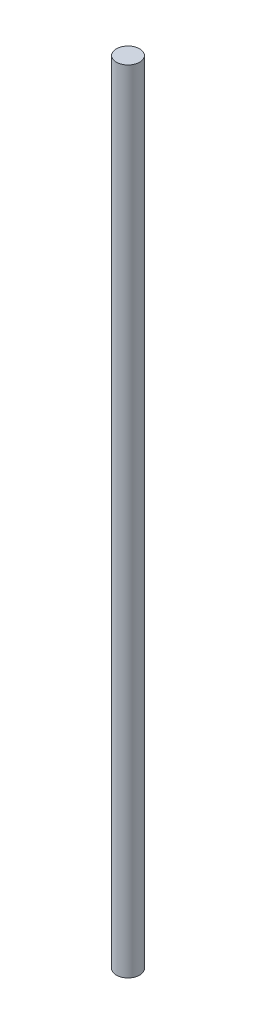
ISO-10303-21;
HEADER;
FILE_DESCRIPTION(('STEP AP214'),'2;1');
FILE_NAME('part.step','',(''),(''),'','','');
FILE_SCHEMA(('AUTOMOTIVE_DESIGN { 1 0 10303 214 1 1 1 1 }'));
ENDSEC;
DATA;
#1=APPLICATION_CONTEXT('core data for automotive mechanical design processes');
#2=APPLICATION_PROTOCOL_DEFINITION('international standard','automotive_design',2000,#1);
#3=PRODUCT_CONTEXT('',#1,'mechanical');
#4=PRODUCT('Part','Part','',(#3));
#5=PRODUCT_RELATED_PRODUCT_CATEGORY('part','',(#4));
#6=PRODUCT_DEFINITION_FORMATION('','',#4);
#7=PRODUCT_DEFINITION_CONTEXT('part definition',#1,'design');
#8=PRODUCT_DEFINITION('design','',#6,#7);
#9=PRODUCT_DEFINITION_SHAPE('','',#8);
#10=(LENGTH_UNIT() NAMED_UNIT(*) SI_UNIT(.MILLI.,.METRE.));
#11=(NAMED_UNIT(*) PLANE_ANGLE_UNIT() SI_UNIT($,.RADIAN.));
#12=(NAMED_UNIT(*) SI_UNIT($,.STERADIAN.) SOLID_ANGLE_UNIT());
#13=UNCERTAINTY_MEASURE_WITH_UNIT(LENGTH_MEASURE(1.E-05),#10,'distance_accuracy_value','');
#14=(GEOMETRIC_REPRESENTATION_CONTEXT(3) GLOBAL_UNCERTAINTY_ASSIGNED_CONTEXT((#13)) GLOBAL_UNIT_ASSIGNED_CONTEXT((#10,
#11,#12)) REPRESENTATION_CONTEXT('',''));
#15=CARTESIAN_POINT('',(0.,0.,0.));
#16=DIRECTION('',(0.,0.,1.));
#17=DIRECTION('',(1.,0.,0.));
#18=AXIS2_PLACEMENT_3D('',#15,#16,#17);
#19=CARTESIAN_POINT('',(0.,300.,0.));
#20=DIRECTION('',(0.,-1.,0.));
#21=DIRECTION('',(0.,0.,-1.));
#22=AXIS2_PLACEMENT_3D('',#19,#20,#21);
#23=CYLINDRICAL_SURFACE('',#22,5.);
#24=CARTESIAN_POINT('',(0.,-20.,0.));
#25=DIRECTION('',(0.,-1.,0.));
#26=DIRECTION('',(0.,0.,-1.));
#27=AXIS2_PLACEMENT_3D('',#24,#25,#26);
#28=CIRCLE('',#27,5.);
#29=CARTESIAN_POINT('',(0.,-20.,-5.));
#30=VERTEX_POINT('',#29);
#31=EDGE_CURVE('E10',#30,#30,#28,.T.);
#32=ORIENTED_EDGE('',*,*,#31,.F.);
#33=EDGE_LOOP('',(#32));
#34=FACE_BOUND('',#33,.T.);
#35=CARTESIAN_POINT('',(0.,320.,0.));
#36=DIRECTION('',(0.,1.,0.));
#37=DIRECTION('',(0.,0.,1.));
#38=AXIS2_PLACEMENT_3D('',#35,#36,#37);
#39=CIRCLE('',#38,5.);
#40=CARTESIAN_POINT('',(0.,320.,5.));
#41=VERTEX_POINT('',#40);
#42=EDGE_CURVE('E37',#41,#41,#39,.T.);
#43=ORIENTED_EDGE('',*,*,#42,.F.);
#44=EDGE_LOOP('',(#43));
#45=FACE_BOUND('',#44,.T.);
#46=ADVANCED_FACE('F31',(#34,#45),#23,.T.);
#47=CARTESIAN_POINT('',(0.,-20.,0.));
#48=DIRECTION('',(0.,-1.,0.));
#49=DIRECTION('',(0.,0.,-1.));
#50=AXIS2_PLACEMENT_3D('',#47,#48,#49);
#51=PLANE('',#50);
#52=ORIENTED_EDGE('',*,*,#31,.T.);
#53=EDGE_LOOP('',(#52));
#54=FACE_BOUND('',#53,.T.);
#55=ADVANCED_FACE('F46',(#54),#51,.T.);
#56=CARTESIAN_POINT('',(0.,320.,0.));
#57=DIRECTION('',(0.,1.,0.));
#58=DIRECTION('',(0.,0.,1.));
#59=AXIS2_PLACEMENT_3D('',#56,#57,#58);
#60=PLANE('',#59);
#61=ORIENTED_EDGE('',*,*,#42,.T.);
#62=EDGE_LOOP('',(#61));
#63=FACE_BOUND('',#62,.T.);
#64=ADVANCED_FACE('F43',(#63),#60,.T.);
#65=CLOSED_SHELL('',(#46,#55,#64));
#66=MANIFOLD_SOLID_BREP('B2',#65);
#67=ADVANCED_BREP_SHAPE_REPRESENTATION('',(#18,#66),#14);
#68=SHAPE_DEFINITION_REPRESENTATION(#9,#67);
ENDSEC;
END-ISO-10303-21;
